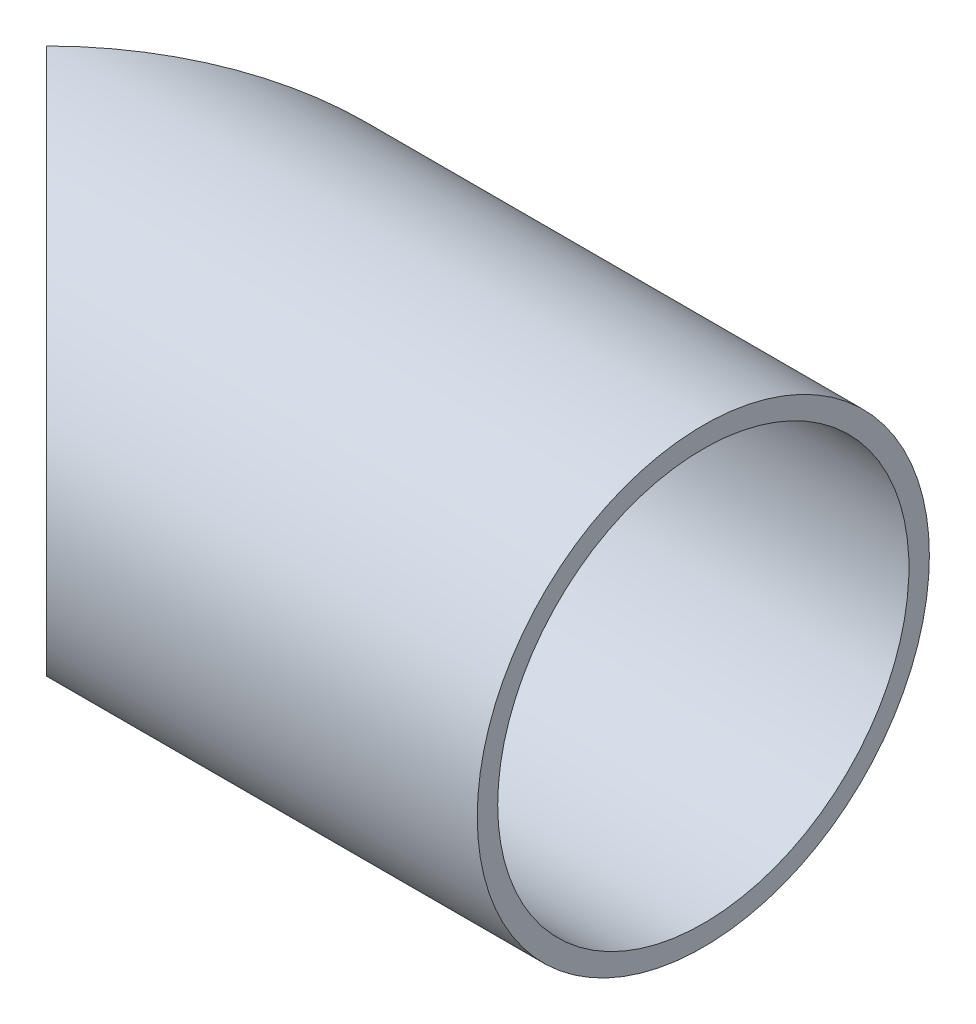
ISO-10303-21;
HEADER;
FILE_DESCRIPTION(('STEP AP214'),'2;1');
FILE_NAME('part.step','',(''),(''),'','','');
FILE_SCHEMA(('AUTOMOTIVE_DESIGN { 1 0 10303 214 1 1 1 1 }'));
ENDSEC;
DATA;
#1=APPLICATION_CONTEXT('core data for automotive mechanical design processes');
#2=APPLICATION_PROTOCOL_DEFINITION('international standard','automotive_design',2000,#1);
#3=PRODUCT_CONTEXT('',#1,'mechanical');
#4=PRODUCT('Part','Part','',(#3));
#5=PRODUCT_RELATED_PRODUCT_CATEGORY('part','',(#4));
#6=PRODUCT_DEFINITION_FORMATION('','',#4);
#7=PRODUCT_DEFINITION_CONTEXT('part definition',#1,'design');
#8=PRODUCT_DEFINITION('design','',#6,#7);
#9=PRODUCT_DEFINITION_SHAPE('','',#8);
#10=(LENGTH_UNIT() NAMED_UNIT(*) SI_UNIT(.MILLI.,.METRE.));
#11=(NAMED_UNIT(*) PLANE_ANGLE_UNIT() SI_UNIT($,.RADIAN.));
#12=(NAMED_UNIT(*) SI_UNIT($,.STERADIAN.) SOLID_ANGLE_UNIT());
#13=UNCERTAINTY_MEASURE_WITH_UNIT(LENGTH_MEASURE(1.E-05),#10,'distance_accuracy_value','');
#14=(GEOMETRIC_REPRESENTATION_CONTEXT(3) GLOBAL_UNCERTAINTY_ASSIGNED_CONTEXT((#13)) GLOBAL_UNIT_ASSIGNED_CONTEXT((#10,
#11,#12)) REPRESENTATION_CONTEXT('',''));
#15=CARTESIAN_POINT('',(0.,0.,0.));
#16=DIRECTION('',(0.,0.,1.));
#17=DIRECTION('',(1.,0.,0.));
#18=AXIS2_PLACEMENT_3D('',#15,#16,#17);
#19=CARTESIAN_POINT('',(0.,0.,0.));
#20=DIRECTION('',(-1.,0.,0.));
#21=DIRECTION('',(0.,0.,1.));
#22=AXIS2_PLACEMENT_3D('',#19,#20,#21);
#23=CYLINDRICAL_SURFACE('',#22,10.5);
#24=CARTESIAN_POINT('',(2.9,0.,-10.5));
#25=CARTESIAN_POINT('',(2.89999779863259,0.0504540532264274,-10.499999495684));
#26=CARTESIAN_POINT('',(2.89574304131396,0.10094232320822,-10.4996324661027));
#27=CARTESIAN_POINT('',(2.87883282986874,0.200521582916165,-10.4982036016795));
#28=CARTESIAN_POINT('',(2.86616789288237,0.249610930056723,-10.497140982548));
#29=CARTESIAN_POINT('',(2.83280657925466,0.344935741813993,-10.4944410029825));
#30=CARTESIAN_POINT('',(2.8121147874592,0.391172818171932,-10.4928039706974));
#31=CARTESIAN_POINT('',(2.76329542521253,0.479506607172749,-10.4891386785699));
#32=CARTESIAN_POINT('',(2.73516943051024,0.521604194627761,-10.487110501659));
#33=CARTESIAN_POINT('',(2.67219851331521,0.600588072516286,-10.4828843609423));
#34=CARTESIAN_POINT('',(2.63733773396015,0.637461700951317,-10.480686003921));
#35=CARTESIAN_POINT('',(2.56192037319322,0.704842285646807,-10.4763705644682));
#36=CARTESIAN_POINT('',(2.52136354000138,0.735348960323559,-10.4742534856346));
#37=CARTESIAN_POINT('',(2.43562827171721,0.789172826367425,-10.4703361100643));
#38=CARTESIAN_POINT('',(2.39044279460022,0.812478839657522,-10.4685363076986));
#39=CARTESIAN_POINT('',(2.29678193125328,0.851168411468692,-10.4654618251682));
#40=CARTESIAN_POINT('',(2.24830660618794,0.866552117235136,-10.4641871352436));
#41=CARTESIAN_POINT('',(2.14956930671322,0.888923537308058,-10.4623105464146));
#42=CARTESIAN_POINT('',(2.09931205148371,0.895931938612588,-10.4617069900681));
#43=CARTESIAN_POINT('',(1.99833119470095,0.901417720323617,-10.4612357811633));
#44=CARTESIAN_POINT('',(1.94760760238042,0.899895269265794,-10.4613681140668));
#45=CARTESIAN_POINT('',(1.84727580502774,0.888379653939853,-10.4623522244313));
#46=CARTESIAN_POINT('',(1.7976649965983,0.878408986097642,-10.4632020911782));
#47=CARTESIAN_POINT('',(1.70082364962664,0.850314925357359,-10.4655225150104));
#48=CARTESIAN_POINT('',(1.65359313551799,0.832191448790167,-10.4669930784657));
#49=CARTESIAN_POINT('',(1.56278146928279,0.788281088630963,-10.4703913988247));
#50=CARTESIAN_POINT('',(1.51920521373779,0.76248412671281,-10.4723197563166));
#51=CARTESIAN_POINT('',(1.43699258714743,0.703966339251911,-10.4764158387747));
#52=CARTESIAN_POINT('',(1.39835632205457,0.671245365243461,-10.4785835688731));
#53=CARTESIAN_POINT('',(1.32698962347084,0.599682275323482,-10.4829226490968));
#54=CARTESIAN_POINT('',(1.2942786854994,0.560820713565983,-10.485093988271));
#55=CARTESIAN_POINT('',(1.23584196887676,0.478147384745274,-10.48918896233));
#56=CARTESIAN_POINT('',(1.21011619525634,0.434335614116919,-10.4911125970364));
#57=CARTESIAN_POINT('',(1.16638122443027,0.342992741040511,-10.4944958198701));
#58=CARTESIAN_POINT('',(1.14837290724387,0.295461215160317,-10.4959553550715));
#59=CARTESIAN_POINT('',(1.12059777300354,0.198033966338504,-10.4982453324096));
#60=CARTESIAN_POINT('',(1.11083077498583,0.148138295334449,-10.4990757883596));
#61=CARTESIAN_POINT('',(1.09984000937305,0.0475680752501909,-10.5000122643458));
#62=CARTESIAN_POINT('',(1.0985893168585,-0.00310351100283923,-10.500120567498));
#63=CARTESIAN_POINT('',(1.1045961067296,-0.103935631344798,-10.4996066360162));
#64=CARTESIAN_POINT('',(1.11185350508279,-0.154096170476285,-10.4989844085976));
#65=CARTESIAN_POINT('',(1.13464814670092,-0.25240542646769,-10.4970808526053));
#66=CARTESIAN_POINT('',(1.1501728931489,-0.300557061811421,-10.4958005189179));
#67=CARTESIAN_POINT('',(1.18904876601968,-0.393572106736426,-10.4927245530826));
#68=CARTESIAN_POINT('',(1.21240002310381,-0.438435461405568,-10.490928912332));
#69=CARTESIAN_POINT('',(1.26633360588341,-0.523722864502319,-10.4870178742457));
#70=CARTESIAN_POINT('',(1.29693374945803,-0.564135608882735,-10.4849016937148));
#71=CARTESIAN_POINT('',(1.36447076597735,-0.639260472507932,-10.4805899025468));
#72=CARTESIAN_POINT('',(1.40140775541085,-0.673972486934518,-10.4783942904502));
#73=CARTESIAN_POINT('',(1.48068688092173,-0.736803049806465,-10.474164321982));
#74=CARTESIAN_POINT('',(1.5230429790687,-0.764904014705594,-10.4721304049669));
#75=CARTESIAN_POINT('',(1.61188857350658,-0.813594189687383,-10.4684604038335));
#76=CARTESIAN_POINT('',(1.65837802647671,-0.834183478486727,-10.4668243155463));
#77=CARTESIAN_POINT('',(1.7541086633372,-0.86723596273692,-10.4641377235078));
#78=CARTESIAN_POINT('',(1.80334612203322,-0.879709882187555,-10.4630864472281));
#79=CARTESIAN_POINT('',(1.90322601721336,-0.896212438900428,-10.4616859509123));
#80=CARTESIAN_POINT('',(1.9538684249532,-0.900241248814861,-10.4613367165236));
#81=CARTESIAN_POINT('',(2.0549459194371,-0.899737177059251,-10.4613800685233));
#82=CARTESIAN_POINT('',(2.10538114727868,-0.895231922008628,-10.4617702612274));
#83=CARTESIAN_POINT('',(2.20477577823446,-0.877845256671528,-10.4632434143281));
#84=CARTESIAN_POINT('',(2.25373517916612,-0.864963833998445,-10.4643263757491));
#85=CARTESIAN_POINT('',(2.34878990647217,-0.831197573762159,-10.4670624094963));
#86=CARTESIAN_POINT('',(2.39488542619592,-0.810313277181222,-10.4687154432858));
#87=CARTESIAN_POINT('',(2.48292067273923,-0.761137152412855,-10.4724054329102));
#88=CARTESIAN_POINT('',(2.52486045920794,-0.732845430568861,-10.4744423832334));
#89=CARTESIAN_POINT('',(2.60353515378189,-0.669553715709395,-10.4786785448443));
#90=CARTESIAN_POINT('',(2.64025355990508,-0.634533242193162,-10.4808782385751));
#91=CARTESIAN_POINT('',(2.7073064080301,-0.558815882240811,-10.4851876266694));
#92=CARTESIAN_POINT('',(2.73763930531487,-0.518117626243553,-10.4872972991577));
#93=CARTESIAN_POINT('',(2.7911032485324,-0.432117196155755,-10.4911929654974));
#94=CARTESIAN_POINT('',(2.81422016310366,-0.386806215934731,-10.4929783214045));
#95=CARTESIAN_POINT('',(2.85248803330017,-0.292961242645931,-10.4960168004137));
#96=CARTESIAN_POINT('',(2.86764812265522,-0.244431017417025,-10.4972705334525));
#97=CARTESIAN_POINT('',(2.88572164829214,-0.163013325447794,-10.4987835505666));
#98=CARTESIAN_POINT('',(2.89106888733595,-0.13064907329781,-10.4992376358007));
#99=CARTESIAN_POINT('',(2.89820877306998,-0.065528025193228,-10.4998460238753));
#100=CARTESIAN_POINT('',(2.90000142984585,-0.0327712303526815,-10.5000003275665));
#101=CARTESIAN_POINT('',(2.9,0.,-10.5));
#102=B_SPLINE_CURVE_WITH_KNOTS('',3,(#24,#25,#26,#27,#28,#29,#30,#31,#32,#33,#34,#35,#36,#37,
#38,#39,#40,#41,#42,#43,#44,#45,#46,#47,#48,#49,#50,#51,#52,#53,#54,#55,#56,#57,#58,#59,#60,#61,
#62,#63,#64,#65,#66,#67,#68,#69,#70,#71,#72,#73,#74,#75,#76,#77,#78,#79,#80,#81,#82,#83,#84,#85,
#86,#87,#88,#89,#90,#91,#92,#93,#94,#95,#96,#97,#98,#99,#100,#101),.UNSPECIFIED.,.T.,.F.,(4,2,2,
2,2,2,2,2,2,2,2,2,2,2,2,2,2,2,2,2,2,2,2,2,2,2,2,2,2,2,2,2,2,2,2,2,2,2,4),(0.,0.151242506586224,
0.302655836191228,0.453982807309265,0.605277728944442,0.75693330990183,0.908595596529989,
1.06049214944224,1.21238587907716,1.36390365066285,1.5154184288712,1.66653100770665,
1.81764513738739,1.96895862277438,2.12027535297661,2.27208124416179,2.42388724467837,
2.57571055098452,2.72753052345152,2.87887028225293,3.03020854631916,3.18131869606406,
3.33243136867472,3.48391940490825,3.63541022621059,3.78729952719736,3.93918723645342,
4.09087382484149,4.24255731211196,4.39375060603966,4.54494412355122,4.69612742241034,
4.84730855095124,4.9989573399949,5.15064277231481,5.30262341951979,5.45442922273313,
5.55266547470274,5.65090144793983),.UNSPECIFIED.);
#103=CARTESIAN_POINT('',(2.9,0.,-10.5));
#104=VERTEX_POINT('',#103);
#105=EDGE_CURVE('E71',#104,#104,#102,.T.);
#106=ORIENTED_EDGE('',*,*,#105,.T.);
#107=EDGE_LOOP('',(#106));
#108=FACE_BOUND('',#107,.T.);
#109=CARTESIAN_POINT('',(20.,0.,0.));
#110=DIRECTION('',(-1.,0.,0.));
#111=DIRECTION('',(0.,0.,1.));
#112=AXIS2_PLACEMENT_3D('',#109,#110,#111);
#113=CIRCLE('',#112,10.5);
#114=CARTESIAN_POINT('',(20.,0.,10.5));
#115=VERTEX_POINT('',#114);
#116=EDGE_CURVE('E68',#115,#115,#113,.T.);
#117=ORIENTED_EDGE('',*,*,#116,.T.);
#118=EDGE_LOOP('',(#117));
#119=FACE_BOUND('',#118,.T.);
#120=CARTESIAN_POINT('',(-10.5,0.,0.));
#121=DIRECTION('',(-0.707106781186547,0.,0.707106781186547));
#122=DIRECTION('',(-0.707106781186547,0.,-0.707106781186547));
#123=AXIS2_PLACEMENT_3D('',#120,#121,#122);
#124=ELLIPSE('',#123,14.8492424049175,10.5);
#125=CARTESIAN_POINT('',(-10.5,-10.5,0.));
#126=VERTEX_POINT('',#125);
#127=CARTESIAN_POINT('',(-10.5,10.5,0.));
#128=VERTEX_POINT('',#127);
#129=EDGE_CURVE('E63',#126,#128,#124,.T.);
#130=ORIENTED_EDGE('',*,*,#129,.F.);
#131=CARTESIAN_POINT('',(-10.5,0.,0.));
#132=DIRECTION('',(-0.707106781186547,0.,-0.707106781186547));
#133=DIRECTION('',(-0.707106781186547,0.,0.707106781186547));
#134=AXIS2_PLACEMENT_3D('',#131,#132,#133);
#135=ELLIPSE('',#134,14.8492424049175,10.5);
#136=EDGE_CURVE('E61',#128,#126,#135,.T.);
#137=ORIENTED_EDGE('',*,*,#136,.F.);
#138=EDGE_LOOP('',(#130,#137));
#139=FACE_BOUND('',#138,.T.);
#140=ADVANCED_FACE('F41',(#108,#119,#139),#23,.T.);
#141=CARTESIAN_POINT('',(0.,0.,0.));
#142=DIRECTION('',(-1.,0.,0.));
#143=DIRECTION('',(0.,0.,1.));
#144=AXIS2_PLACEMENT_3D('',#141,#142,#143);
#145=CYLINDRICAL_SURFACE('',#144,9.55);
#146=CARTESIAN_POINT('',(2.9,0.,-9.55));
#147=CARTESIAN_POINT('',(2.89999780884723,0.0504333770996798,-9.54999944986076));
#148=CARTESIAN_POINT('',(2.89574652294859,0.10090046045354,-9.54959624319821));
#149=CARTESIAN_POINT('',(2.87885090630755,0.200436515602091,-9.54802654191983));
#150=CARTESIAN_POINT('',(2.86619723287062,0.249503867610081,-9.54685919767271));
#151=CARTESIAN_POINT('',(2.83286757719439,0.344784592035012,-9.54389304594052));
#152=CARTESIAN_POINT('',(2.81219632838323,0.390999629779705,-9.54209461109924));
#153=CARTESIAN_POINT('',(2.76342723367341,0.479293648716003,-9.53806758968694));
#154=CARTESIAN_POINT('',(2.73533090538013,0.521373472691947,-9.53583909104136));
#155=CARTESIAN_POINT('',(2.67241207481323,0.60034829386983,-9.53119372234366));
#156=CARTESIAN_POINT('',(2.63757059272861,0.637228140771976,-9.52877633250596));
#157=CARTESIAN_POINT('',(2.56219084559125,0.704625983614027,-9.52402995716957));
#158=CARTESIAN_POINT('',(2.52165232213063,0.735143690822338,-9.52170097568703));
#159=CARTESIAN_POINT('',(2.4359354205909,0.789003849134793,-9.51738971398328));
#160=CARTESIAN_POINT('',(2.3907484739012,0.812332720824696,-9.5154080929178));
#161=CARTESIAN_POINT('',(2.29707693999983,0.851066269194833,-9.51202220660178));
#162=CARTESIAN_POINT('',(2.24859242574987,0.866471121136757,-9.51061792858185));
#163=CARTESIAN_POINT('',(2.14985570426576,0.888874745261589,-9.50855032038307));
#164=CARTESIAN_POINT('',(2.09960921326338,0.895898503288517,-9.50788478825972));
#165=CARTESIAN_POINT('',(1.99864646686942,0.901417779764297,-9.50736315078987));
#166=CARTESIAN_POINT('',(1.94793022255865,0.89991349886831,-9.50750702639891));
#167=CARTESIAN_POINT('',(1.84763948270622,0.888440012128942,-9.50858594049473));
#168=CARTESIAN_POINT('',(1.79806184024906,0.878498040804204,-9.50951843350977));
#169=CARTESIAN_POINT('',(1.70128201593777,0.850473741980112,-9.51206553255591));
#170=CARTESIAN_POINT('',(1.65407986294127,0.832391315616407,-9.51368014687123));
#171=CARTESIAN_POINT('',(1.5633046024765,0.788569181007379,-9.51741249285591));
#172=CARTESIAN_POINT('',(1.5197373861864,0.76281734005178,-9.51953102061922));
#173=CARTESIAN_POINT('',(1.43753316280169,0.704396104543006,-9.52403179493855));
#174=CARTESIAN_POINT('',(1.39889628380095,0.671726530320523,-9.52641404834336));
#175=CARTESIAN_POINT('',(1.32749120040153,0.600244852158614,-9.53118519179668));
#176=CARTESIAN_POINT('',(1.29474654517105,0.561409218968174,-9.53357407135109));
#177=CARTESIAN_POINT('',(1.23623777026864,0.478779667011638,-9.538080473618));
#178=CARTESIAN_POINT('',(1.21047365715728,0.434985743585615,-9.54019799607546));
#179=CARTESIAN_POINT('',(1.16665845040846,0.343666812908452,-9.54392368126632));
#180=CARTESIAN_POINT('',(1.14860849602396,0.296141255783032,-9.54553176875558));
#181=CARTESIAN_POINT('',(1.12075095493928,0.198715582138872,-9.54805659777153));
#182=CARTESIAN_POINT('',(1.11094314939205,0.148815528705376,-9.5489733576544));
#183=CARTESIAN_POINT('',(1.09987806053933,0.0482613452693576,-9.55000988090179));
#184=CARTESIAN_POINT('',(1.09858826966231,-0.00238917764715689,-9.55013267426844));
#185=CARTESIAN_POINT('',(1.10451052342864,-0.103185689674357,-9.54957554202111));
#186=CARTESIAN_POINT('',(1.11172246626403,-0.153331684819493,-9.54889562601955));
#187=CARTESIAN_POINT('',(1.13441650728167,-0.251602270308619,-9.54681144375323));
#188=CARTESIAN_POINT('',(1.14988344064045,-0.299730393282177,-9.54540850587721));
#189=CARTESIAN_POINT('',(1.18863286384996,-0.392708722858053,-9.54203574606673));
#190=CARTESIAN_POINT('',(1.21191551023524,-0.43755886378643,-9.54006591277849));
#191=CARTESIAN_POINT('',(1.26571646196012,-0.522855427342952,-9.53577232362892));
#192=CARTESIAN_POINT('',(1.29625619032409,-0.563288284157764,-9.53344752731578));
#193=CARTESIAN_POINT('',(1.36367359454641,-0.638465358868746,-9.52870838913467));
#194=CARTESIAN_POINT('',(1.40055141144753,-0.673209450138052,-9.52629404527493));
#195=CARTESIAN_POINT('',(1.47973972521151,-0.736135109087978,-9.52163885943567));
#196=CARTESIAN_POINT('',(1.52206717901137,-0.764295386200231,-9.519398595567));
#197=CARTESIAN_POINT('',(1.6108693292807,-0.813107828374153,-9.51535380895649));
#198=CARTESIAN_POINT('',(1.65734397455804,-0.833760086097369,-9.51354928083703));
#199=CARTESIAN_POINT('',(1.7530473813198,-0.866934375988278,-9.51058377013521));
#200=CARTESIAN_POINT('',(1.80227167273399,-0.879469209437664,-9.50942177469564));
#201=CARTESIAN_POINT('',(1.90213774704683,-0.896094421889859,-9.50786966745646));
#202=CARTESIAN_POINT('',(1.95277949420117,-0.900185013639004,-9.50747953621032));
#203=CARTESIAN_POINT('',(2.05383134902245,-0.899802857234391,-9.50751569560366));
#204=CARTESIAN_POINT('',(2.1042415876694,-0.895363555868843,-9.50793879745557));
#205=CARTESIAN_POINT('',(2.20359689541702,-0.878117616382852,-9.5095469600127));
#206=CARTESIAN_POINT('',(2.252541962636,-0.865310967516846,-9.51073202169644));
#207=CARTESIAN_POINT('',(2.34757817499034,-0.831702827483668,-9.5137297099796));
#208=CARTESIAN_POINT('',(2.39366962192334,-0.81090218344074,-9.51554227008094));
#209=CARTESIAN_POINT('',(2.4817120991938,-0.761900042630001,-9.51959085689515));
#210=CARTESIAN_POINT('',(2.5236631679333,-0.73369861451339,-9.52182687967985));
#211=CARTESIAN_POINT('',(2.6024054323216,-0.670569715972579,-9.5264809309625));
#212=CARTESIAN_POINT('',(2.63917663942982,-0.635617361075034,-9.52889961201889));
#213=CARTESIAN_POINT('',(2.70634737504161,-0.560026869644902,-9.53364048294526));
#214=CARTESIAN_POINT('',(2.73674536970598,-0.519387368303574,-9.53596264947956));
#215=CARTESIAN_POINT('',(2.79035973214162,-0.433476748777413,-9.54025421807277));
#216=CARTESIAN_POINT('',(2.81355960911384,-0.388195306872946,-9.54222280580866));
#217=CARTESIAN_POINT('',(2.85199626463914,-0.294390688424181,-9.54557634391662));
#218=CARTESIAN_POINT('',(2.86724208582308,-0.245871264127059,-9.5469619566998));
#219=CARTESIAN_POINT('',(2.88550646475054,-0.164227381576658,-9.54864249295145));
#220=CARTESIAN_POINT('',(2.89093418874281,-0.131626030054151,-9.54914920496252));
#221=CARTESIAN_POINT('',(2.89818166719427,-0.0660212670045082,-9.54982813797415));
#222=CARTESIAN_POINT('',(2.9000014345097,-0.0330178569104508,-9.55000036016661));
#223=CARTESIAN_POINT('',(2.9,0.,-9.55));
#224=B_SPLINE_CURVE_WITH_KNOTS('',3,(#146,#147,#148,#149,#150,#151,#152,#153,#154,#155,#156,
#157,#158,#159,#160,#161,#162,#163,#164,#165,#166,#167,#168,#169,#170,#171,#172,#173,#174,#175,
#176,#177,#178,#179,#180,#181,#182,#183,#184,#185,#186,#187,#188,#189,#190,#191,#192,#193,#194,
#195,#196,#197,#198,#199,#200,#201,#202,#203,#204,#205,#206,#207,#208,#209,#210,#211,#212,#213,
#214,#215,#216,#217,#218,#219,#220,#221,#222,#223),.UNSPECIFIED.,.T.,.F.,(4,2,2,2,2,2,2,2,2,2,2,
2,2,2,2,2,2,2,2,2,2,2,2,2,2,2,2,2,2,2,2,2,2,2,2,2,2,2,4),(0.,0.151179568943383,
0.302527517995877,0.453786249695487,0.605014089635808,0.756673814001164,0.908340419609051,
1.06029178542309,1.21223979026641,1.36373366455058,1.51522397436914,1.66622716711341,
1.81723219381355,1.96847738499538,2.11972650484168,2.27156730203569,2.42340824193469,
2.57527159847291,2.72713092257962,2.87841036452192,3.02968799491667,3.18068867261004,
3.33169237475346,3.48314750462419,3.63460600529327,3.78654771570448,3.93848755083656,
4.09018718761486,4.24188300238795,4.39298521236683,4.54408761639542,4.69517401250463,
4.84625900715479,4.99791192493686,5.14960129919244,5.30163566873958,5.45349681810327,
5.55247181143082,5.65144645207981),.UNSPECIFIED.);
#225=CARTESIAN_POINT('',(2.9,0.,-9.55));
#226=VERTEX_POINT('',#225);
#227=EDGE_CURVE('E45',#226,#226,#224,.T.);
#228=ORIENTED_EDGE('',*,*,#227,.F.);
#229=EDGE_LOOP('',(#228));
#230=FACE_BOUND('',#229,.T.);
#231=CARTESIAN_POINT('',(20.,0.,0.));
#232=DIRECTION('',(-1.,0.,0.));
#233=DIRECTION('',(0.,0.,1.));
#234=AXIS2_PLACEMENT_3D('',#231,#232,#233);
#235=CIRCLE('',#234,9.55);
#236=CARTESIAN_POINT('',(20.,0.,9.55));
#237=VERTEX_POINT('',#236);
#238=EDGE_CURVE('E55',#237,#237,#235,.T.);
#239=ORIENTED_EDGE('',*,*,#238,.F.);
#240=EDGE_LOOP('',(#239));
#241=FACE_BOUND('',#240,.T.);
#242=CARTESIAN_POINT('',(0.,0.,9.55));
#243=CARTESIAN_POINT('',(-1.55016439686144E-06,0.220574282213808,9.54999842880472));
#244=CARTESIAN_POINT('',(-0.00696527093612184,0.441172881995941,9.54234347170654));
#245=CARTESIAN_POINT('',(-0.0346645493320943,0.880462247515584,9.51187602399584));
#246=CARTESIAN_POINT('',(-0.0554021637739905,1.09915272337616,9.48906126961228));
#247=CARTESIAN_POINT('',(-0.110201791348231,1.53294557827491,9.42870970253865));
#248=CARTESIAN_POINT('',(-0.14427303400446,1.74804536407523,9.39116269214881));
#249=CARTESIAN_POINT('',(-0.225014344574038,2.17288523109862,9.3020527420049));
#250=CARTESIAN_POINT('',(-0.271684243147141,2.38262538431976,9.25048999063825));
#251=CARTESIAN_POINT('',(-0.376354500288009,2.79402169189252,9.13462156791325));
#252=CARTESIAN_POINT('',(-0.434276671799415,2.99572267224584,9.07040378873359));
#253=CARTESIAN_POINT('',(-0.560662161095531,3.39157156837163,8.92994266069807));
#254=CARTESIAN_POINT('',(-0.629130112691609,3.58571611664613,8.8536940251277));
#255=CARTESIAN_POINT('',(-0.775515277782854,3.96558031099309,8.69019158388276));
#256=CARTESIAN_POINT('',(-0.853431642258823,4.1513007119882,8.60293876699807));
#257=CARTESIAN_POINT('',(-1.01765518739125,4.5138410023519,8.41838077874061));
#258=CARTESIAN_POINT('',(-1.10396426166289,4.690658869353,8.32107333846988));
#259=CARTESIAN_POINT('',(-1.31986214971061,5.10381809523147,8.07662760886038));
#260=CARTESIAN_POINT('',(-1.45297333421459,5.33574141040884,7.92510450748946));
#261=CARTESIAN_POINT('',(-1.73085282433067,5.78109040833513,7.60634907398851));
#262=CARTESIAN_POINT('',(-1.87562542236348,5.99450921923345,7.4391109535482));
#263=CARTESIAN_POINT('',(-2.17455742239463,6.40322035683602,7.09038668656487));
#264=CARTESIAN_POINT('',(-2.32873565544062,6.59847420245711,6.90887173127468));
#265=CARTESIAN_POINT('',(-2.64373683377131,6.97054793975606,6.53328725090287));
#266=CARTESIAN_POINT('',(-2.80455892597966,7.14737018785558,6.33921933583127));
#267=CARTESIAN_POINT('',(-3.13433265841546,7.48694031348743,5.93461444534024));
#268=CARTESIAN_POINT('',(-3.30338672880583,7.64925095561886,5.72379475912219));
#269=CARTESIAN_POINT('',(-3.64317701026206,7.95526535394853,5.29024495199638));
#270=CARTESIAN_POINT('',(-3.81391363140587,8.09896444700987,5.06751186585329));
#271=CARTESIAN_POINT('',(-4.15340186997913,8.36764221697699,4.61034249956056));
#272=CARTESIAN_POINT('',(-4.32215653170289,8.49265445083188,4.3759282307238));
#273=CARTESIAN_POINT('',(-4.65354709873289,8.72409021537935,3.89412032272076));
#274=CARTESIAN_POINT('',(-4.81618654298043,8.83052463132022,3.64673439525906));
#275=CARTESIAN_POINT('',(-5.12678136776727,9.02282379238248,3.14060418456797));
#276=CARTESIAN_POINT('',(-5.27491604729169,9.10896542905147,2.88207768132384));
#277=CARTESIAN_POINT('',(-5.5495244958063,9.26106423459288,2.34783724410935));
#278=CARTESIAN_POINT('',(-5.67600831919718,9.32703078379462,2.07213136961774));
#279=CARTESIAN_POINT('',(-5.87376299125925,9.42646281802629,1.54988898553449));
#280=CARTESIAN_POINT('',(-5.95075851300733,9.46354198625341,1.3063292929072));
#281=CARTESIAN_POINT('',(-6.03863095389858,9.5051156604462,0.933241147135417));
#282=CARTESIAN_POINT('',(-6.06330776869749,9.51662835144927,0.807711715494538));
#283=CARTESIAN_POINT('',(-6.10231346885637,9.53471679589305,0.554730248925886));
#284=CARTESIAN_POINT('',(-6.11664768833331,9.54129509427963,0.427279239714138));
#285=CARTESIAN_POINT('',(-6.13423022132566,9.54935347275128,0.170331434968808));
#286=CARTESIAN_POINT('',(-6.13738140884579,9.55078888728765,0.0408264818638232));
#287=CARTESIAN_POINT('',(-6.13213442875822,9.5483903189909,-0.217896091016035));
#288=CARTESIAN_POINT('',(-6.12373623181743,9.54455632277454,-0.347113710060302));
#289=CARTESIAN_POINT('',(-6.09587687143741,9.53173277981832,-0.604303203875862));
#290=CARTESIAN_POINT('',(-6.07639619089835,9.52273413749397,-0.73227247472453));
#291=CARTESIAN_POINT('',(-6.027427787887,9.49983278261041,-0.985850857175301));
#292=CARTESIAN_POINT('',(-5.99793593953962,9.48592804802359,-1.11145897311979));
#293=CARTESIAN_POINT('',(-5.91862014082505,9.44793606754178,-1.40263364741395));
#294=CARTESIAN_POINT('',(-5.86529191237304,9.42199042998925,-1.56700001627018));
#295=CARTESIAN_POINT('',(-5.74643425151322,9.36258607244638,-1.88983172148564));
#296=CARTESIAN_POINT('',(-5.68089874111454,9.32912360812019,-2.04829407086992));
#297=CARTESIAN_POINT('',(-5.54044586625239,9.25522192061193,-2.35989167110624));
#298=CARTESIAN_POINT('',(-5.46549988165019,9.2147612657087,-2.51300876823414));
#299=CARTESIAN_POINT('',(-5.30878294373484,9.12739532255464,-2.81383754919094));
#300=CARTESIAN_POINT('',(-5.22700936346913,9.08048754921492,-2.96154712071158));
#301=CARTESIAN_POINT('',(-4.97971373213672,8.93376801289111,-3.38805371462386));
#302=CARTESIAN_POINT('',(-4.80747165859402,8.82554744306821,-3.66008411362371));
#303=CARTESIAN_POINT('',(-4.45411542320309,8.5873690991685,-4.18850412978263));
#304=CARTESIAN_POINT('',(-4.27299416560689,8.45739373284015,-4.44488085757127));
#305=CARTESIAN_POINT('',(-3.90760562078547,8.17579532747067,-4.94378367640393));
#306=CARTESIAN_POINT('',(-3.72333415391744,8.02414118306894,-5.18628915219097));
#307=CARTESIAN_POINT('',(-3.35631516803992,7.69921205279239,-5.65742621861303));
#308=CARTESIAN_POINT('',(-3.1735672007705,7.52594368457637,-5.88606202403615));
#309=CARTESIAN_POINT('',(-2.80237844453799,7.14641215074716,-6.34227659181887));
#310=CARTESIAN_POINT('',(-2.61424293910516,6.93880150606195,-6.56898825916854));
#311=CARTESIAN_POINT('',(-2.24743480802765,6.49825750589455,-7.00508427261457));
#312=CARTESIAN_POINT('',(-2.06876488349823,6.26531697950263,-7.21446368223293));
#313=CARTESIAN_POINT('',(-1.72547517913569,5.7746924001176,-7.61281439753804));
#314=CARTESIAN_POINT('',(-1.56081014356669,5.51709424697263,-7.80185200581992));
#315=CARTESIAN_POINT('',(-1.24912709947325,4.97679050123585,-8.15710733119698));
#316=CARTESIAN_POINT('',(-1.10209586667824,4.69410400372635,-8.32334216259646));
#317=CARTESIAN_POINT('',(-0.88163422302096,4.21636767624743,-8.57130906887679));
#318=CARTESIAN_POINT('',(-0.801407965519166,4.02863909924136,-8.6612124109364));
#319=CARTESIAN_POINT('',(-0.650614447134722,3.64446798100714,-8.82974032908086));
#320=CARTESIAN_POINT('',(-0.580044221428796,3.4480281391575,-8.90836836753385));
#321=CARTESIAN_POINT('',(-0.449698740162347,3.04726506666906,-9.05328985743474));
#322=CARTESIAN_POINT('',(-0.38991868085887,2.84294539351745,-9.11958879815221));
#323=CARTESIAN_POINT('',(-0.282179367565618,2.42738687747593,-9.23888602283679));
#324=CARTESIAN_POINT('',(-0.234220517322117,2.21614779853695,-9.2918838525136));
#325=CARTESIAN_POINT('',(-0.150793550150092,1.78664586683344,-9.38397342422707));
#326=CARTESIAN_POINT('',(-0.115413410838005,1.56834476105856,-9.42296723831616));
#327=CARTESIAN_POINT('',(-0.0583800258488412,1.12778583339814,-9.48578416990148));
#328=CARTESIAN_POINT('',(-0.0367267258778368,0.905528027166156,-9.50960734740232));
#329=CARTESIAN_POINT('',(-0.00765383558497846,0.459028304646362,-9.54158647466287));
#330=CARTESIAN_POINT('',(-0.000229694721637733,0.234787045729678,-9.5497474332634));
#331=CARTESIAN_POINT('',(0.000219124936845714,-0.213717340796843,-9.55024094550488));
#332=CARTESIAN_POINT('',(-0.00675507279201301,-0.437980465335204,-9.54257473411093));
#333=CARTESIAN_POINT('',(-0.0335016574610959,-0.86189247565072,-9.51315507943714));
#334=CARTESIAN_POINT('',(-0.0519074469753848,-1.06173555258608,-9.4929057714004));
#335=CARTESIAN_POINT('',(-0.0998691105156604,-1.4584984233658,-9.44009242510562));
#336=CARTESIAN_POINT('',(-0.129428689094243,-1.65541722334843,-9.4075242953393));
#337=CARTESIAN_POINT('',(-0.199159472190343,-2.04495202889887,-9.33059907394564));
#338=CARTESIAN_POINT('',(-0.239327631883227,-2.23756925190819,-9.28624536493706));
#339=CARTESIAN_POINT('',(-0.329625249103798,-2.61756345827491,-9.18637454613411));
#340=CARTESIAN_POINT('',(-0.379758491656294,-2.80493841952664,-9.13085319445234));
#341=CARTESIAN_POINT('',(-0.491127015721263,-3.17994202893174,-9.00726278309859));
#342=CARTESIAN_POINT('',(-0.552688439581524,-3.36735173775612,-8.93882372601649));
#343=CARTESIAN_POINT('',(-0.68475294384914,-3.73485052400045,-8.7916224914048));
#344=CARTESIAN_POINT('',(-0.755259471112304,-3.91493674391526,-8.71285633409526));
#345=CARTESIAN_POINT('',(-0.978821115870656,-4.44333351095992,-8.46233264749426));
#346=CARTESIAN_POINT('',(-1.14397100553179,-4.77995525991497,-8.276291716785));
#347=CARTESIAN_POINT('',(-1.45577527514599,-5.34123078164447,-7.92185300040737));
#348=CARTESIAN_POINT('',(-1.59717267999165,-5.57321605625746,-7.76015281121345));
#349=CARTESIAN_POINT('',(-1.89131624315496,-6.01759840129866,-7.42085572572695));
#350=CARTESIAN_POINT('',(-2.0440635837837,-6.22999342585116,-7.24325717292261));
#351=CARTESIAN_POINT('',(-2.3585961690449,-6.63578666892647,-6.87345998931173));
#352=CARTESIAN_POINT('',(-2.52040625538978,-6.82912821786666,-6.68122065104451));
#353=CARTESIAN_POINT('',(-2.84999592920941,-7.19640821191732,-6.28389901134157));
#354=CARTESIAN_POINT('',(-3.01777447937636,-7.37035000714801,-6.07881893693773));
#355=CARTESIAN_POINT('',(-3.36067726999039,-7.70314852272935,-5.6514702391412));
#356=CARTESIAN_POINT('',(-3.53588122529484,-7.86154499439963,-5.42890784024927));
#357=CARTESIAN_POINT('',(-3.88655939829433,-8.15875092567028,-4.97109786462189));
#358=CARTESIAN_POINT('',(-4.06203369437093,-8.29755277696001,-4.73584540925324));
#359=CARTESIAN_POINT('',(-4.40867656370908,-8.5552481480142,-4.25265286559878));
#360=CARTESIAN_POINT('',(-4.57985454524045,-8.67418912250699,-4.00474492341309));
#361=CARTESIAN_POINT('',(-4.91252157230955,-8.89210225627363,-3.49428215853422));
#362=CARTESIAN_POINT('',(-5.07401932511121,-8.9910925562596,-3.23174092145891));
#363=CARTESIAN_POINT('',(-5.36266587688179,-9.15874818611278,-2.71755880998305));
#364=CARTESIAN_POINT('',(-5.49164054694359,-9.22950149679591,-2.4676459560891));
#365=CARTESIAN_POINT('',(-5.72457087064195,-9.3521421616201,-1.9519150448992));
#366=CARTESIAN_POINT('',(-5.82856259256946,-9.40405676949879,-1.68612061735177));
#367=CARTESIAN_POINT('',(-5.98314640959704,-9.47914990721538,-1.18383630669148));
#368=CARTESIAN_POINT('',(-6.03972320498754,-9.50565951744332,-0.949762575941793));
#369=CARTESIAN_POINT('',(-6.11614273105334,-9.54115890450965,-0.474565079416246));
#370=CARTESIAN_POINT('',(-6.13606869218358,-9.55018837947899,-0.233458553553935));
#371=CARTESIAN_POINT('',(-6.13522863849038,-9.5498050692226,0.249292214041436));
#372=CARTESIAN_POINT('',(-6.1143550750188,-9.54034354122291,0.490936195235516));
#373=CARTESIAN_POINT('',(-6.03602543076314,-9.50392683143218,0.967064897376575));
#374=CARTESIAN_POINT('',(-5.97848689061578,-9.47693221516291,1.2015322291637));
#375=CARTESIAN_POINT('',(-5.85168559259474,-9.41525105845096,1.60879647050014));
#376=CARTESIAN_POINT('',(-5.78778459086933,-9.38356199317581,1.78381538349107));
#377=CARTESIAN_POINT('',(-5.64744607354793,-9.31176329366399,2.12704288786811));
#378=CARTESIAN_POINT('',(-5.57099991177105,-9.27164784655007,2.29524668184409));
#379=CARTESIAN_POINT('',(-5.40876509143229,-9.18356525635248,2.62563838023031));
#380=CARTESIAN_POINT('',(-5.32294522738967,-9.13557160226819,2.78780362236339));
#381=CARTESIAN_POINT('',(-5.14478584287353,-9.03229319382483,3.10614995278231));
#382=CARTESIAN_POINT('',(-5.05244388733959,-8.97700570951484,3.2623287720705));
#383=CARTESIAN_POINT('',(-4.77949030855163,-8.80736566189615,3.7052748442559));
#384=CARTESIAN_POINT('',(-4.59316594435262,-8.68408505154265,3.98513183346054));
#385=CARTESIAN_POINT('',(-4.21380676182913,-8.41357811533717,4.52838178440256));
#386=CARTESIAN_POINT('',(-4.02076684249144,-8.26633326001688,4.79176178600195));
#387=CARTESIAN_POINT('',(-3.63402238874577,-7.94802301867264,5.30302154533462));
#388=CARTESIAN_POINT('',(-3.44031812473744,-7.77696640902357,5.55090696539946));
#389=CARTESIAN_POINT('',(-3.05676928313712,-7.41071038283583,6.03116857041811));
#390=CARTESIAN_POINT('',(-2.86692293302201,-7.21552235952821,6.2635519951875));
#391=CARTESIAN_POINT('',(-2.52844886741774,-6.83787899658739,6.6714761455923));
#392=CARTESIAN_POINT('',(-2.37855749233809,-6.65946577103518,6.8497147134133));
#393=CARTESIAN_POINT('',(-2.08601202851851,-6.28578582443041,7.19416157233789));
#394=CARTESIAN_POINT('',(-1.94335826422942,-6.09051834888612,7.36036932426098));
#395=CARTESIAN_POINT('',(-1.66768229174375,-5.68335482766449,7.67910907728425));
#396=CARTESIAN_POINT('',(-1.5346455253329,-5.47148497294588,7.83166183642432));
#397=CARTESIAN_POINT('',(-1.28026762720683,-5.03102026975657,8.1216257135314));
#398=CARTESIAN_POINT('',(-1.1589232179385,-4.80243014003524,8.25904107630672));
#399=CARTESIAN_POINT('',(-0.955791038379298,-4.38176245248664,8.48802423180545));
#400=CARTESIAN_POINT('',(-0.871209135834402,-4.19287709583013,8.58299028147399));
#401=CARTESIAN_POINT('',(-0.71177245970175,-3.80583506867972,8.76147868470747));
#402=CARTESIAN_POINT('',(-0.636915543339968,-3.6076804536776,8.8450035594076));
#403=CARTESIAN_POINT('',(-0.498181844881826,-3.20302026408344,8.99944531909741));
#404=CARTESIAN_POINT('',(-0.434294435193521,-2.9965230145009,9.07037440957541));
#405=CARTESIAN_POINT('',(-0.318573329693684,-2.57605594538368,9.19862566557317));
#406=CARTESIAN_POINT('',(-0.266737559963487,-2.36208741885133,9.25595017228682));
#407=CARTESIAN_POINT('',(-0.185266226058173,-1.97171328125714,9.34593595730118));
#408=CARTESIAN_POINT('',(-0.153262567295041,-1.79640456917985,9.38123866055458));
#409=CARTESIAN_POINT('',(-0.0980525974233897,-1.44274309790956,9.44209585790084));
#410=CARTESIAN_POINT('',(-0.0748451944536637,-1.26439071939464,9.46765156187122));
#411=CARTESIAN_POINT('',(-0.0375655777588238,-0.905543899869689,9.50868590742168));
#412=CARTESIAN_POINT('',(-0.0234950779382622,-0.725049063438531,9.52416265838863));
#413=CARTESIAN_POINT('',(-0.00471293754264724,-0.36304144571577,9.54481893587073));
#414=CARTESIAN_POINT('',(1.2757594498768E-06,-0.18152895802145,9.55000129306753));
#415=CARTESIAN_POINT('',(0.,0.,9.55));
#416=B_SPLINE_CURVE_WITH_KNOTS('',3,(#242,#243,#244,#245,#246,#247,#248,#249,#250,#251,#252,
#253,#254,#255,#256,#257,#258,#259,#260,#261,#262,#263,#264,#265,#266,#267,#268,#269,#270,#271,
#272,#273,#274,#275,#276,#277,#278,#279,#280,#281,#282,#283,#284,#285,#286,#287,#288,#289,#290,
#291,#292,#293,#294,#295,#296,#297,#298,#299,#300,#301,#302,#303,#304,#305,#306,#307,#308,#309,
#310,#311,#312,#313,#314,#315,#316,#317,#318,#319,#320,#321,#322,#323,#324,#325,#326,#327,#328,
#329,#330,#331,#332,#333,#334,#335,#336,#337,#338,#339,#340,#341,#342,#343,#344,#345,#346,#347,
#348,#349,#350,#351,#352,#353,#354,#355,#356,#357,#358,#359,#360,#361,#362,#363,#364,#365,#366,
#367,#368,#369,#370,#371,#372,#373,#374,#375,#376,#377,#378,#379,#380,#381,#382,#383,#384,#385,
#386,#387,#388,#389,#390,#391,#392,#393,#394,#395,#396,#397,#398,#399,#400,#401,#402,#403,#404,
#405,#406,#407,#408,#409,#410,#411,#412,#413,#414,#415),.UNSPECIFIED.,.T.,.F.,(4,2,2,2,2,2,2,2,
2,2,2,2,2,2,2,2,2,2,2,2,2,2,2,2,2,2,2,2,2,2,2,2,2,2,2,2,2,2,2,2,2,2,2,2,2,2,2,2,2,2,2,2,2,2,2,2,
2,2,2,2,2,2,2,2,2,2,2,2,2,2,2,2,2,2,2,2,2,2,2,2,2,2,2,2,2,2,4),(0.,0.661524985005622,
1.32314877593289,1.98523135453965,2.64730503444751,3.30493296630472,3.96285068831393,
4.62070933464153,5.27871675704393,6.19941696622254,7.12045763604393,8.04340702972203,
8.96623828213189,9.91111927364743,10.856236549674,11.7996356972298,12.742480212383,
13.6715990401252,14.6002852186023,15.3715601642722,15.7564563451032,16.1411538764113,
16.5291844851474,16.9172160794046,17.3059331517399,17.6948106198648,18.2181444799897,
18.7417396073026,19.266967575499,19.7923985674158,20.8098377936896,21.8281037938835,
22.8478457775277,23.8672763080577,24.9471741500608,26.0273785118817,27.1039479760433,
28.1797049626437,28.8483438883423,29.5167770497839,30.1849118892431,30.8530695452842,
31.5258125038447,32.1985528014805,32.8710779181799,33.5435505609592,34.1479692160039,
34.7525887959895,35.3570350291655,35.9617112886162,36.5874703916534,37.2134713577419,
38.4649082977989,39.412257242812,40.3597050109078,41.309890662669,42.25991197311,43.23265333002,
44.2057713556861,45.1765299108154,46.1464017540108,47.0149199501661,47.8821766139602,
48.6061112568693,49.3283998757335,50.0525950347917,50.7784246815371,51.3446195662641,
51.9112063266779,52.4797403413913,53.0484877552008,54.1211915528826,55.1947287545062,
56.267871321583,57.3405091440393,58.2198876015846,59.0993054455295,59.9773628686064,
60.8551734378255,61.5376764281848,62.2200287819267,62.9017162753158,63.5832863728505,
64.1278256859141,64.6722973842753,65.2168711854115,65.7612952226473),.UNSPECIFIED.);
#417=CARTESIAN_POINT('',(0.,0.,9.55));
#418=VERTEX_POINT('',#417);
#419=EDGE_CURVE('E11',#418,#418,#416,.T.);
#420=ORIENTED_EDGE('',*,*,#419,.T.);
#421=EDGE_LOOP('',(#420));
#422=FACE_BOUND('',#421,.T.);
#423=ADVANCED_FACE('F89',(#230,#241,#422),#145,.F.);
#424=CARTESIAN_POINT('',(20.,0.,0.));
#425=DIRECTION('',(-1.,0.,0.));
#426=DIRECTION('',(0.,0.,1.));
#427=AXIS2_PLACEMENT_3D('',#424,#425,#426);
#428=PLANE('',#427);
#429=ORIENTED_EDGE('',*,*,#116,.F.);
#430=EDGE_LOOP('',(#429));
#431=FACE_BOUND('',#430,.T.);
#432=ORIENTED_EDGE('',*,*,#238,.T.);
#433=EDGE_LOOP('',(#432));
#434=FACE_BOUND('',#433,.T.);
#435=ADVANCED_FACE('F95',(#431,#434),#428,.F.);
#436=CARTESIAN_POINT('',(-10.5,0.,-10.5));
#437=DIRECTION('',(0.,0.,1.));
#438=DIRECTION('',(1.,0.,0.));
#439=AXIS2_PLACEMENT_3D('',#436,#437,#438);
#440=CYLINDRICAL_SURFACE('',#439,10.5);
#441=ORIENTED_EDGE('',*,*,#129,.T.);
#442=ORIENTED_EDGE('',*,*,#136,.T.);
#443=EDGE_LOOP('',(#441,#442));
#444=FACE_BOUND('',#443,.T.);
#445=ORIENTED_EDGE('',*,*,#419,.F.);
#446=EDGE_LOOP('',(#445));
#447=FACE_BOUND('',#446,.T.);
#448=ADVANCED_FACE('F64',(#444,#447),#440,.F.);
#449=CARTESIAN_POINT('',(2.,0.,-10.5));
#450=DIRECTION('',(0.,0.,1.));
#451=DIRECTION('',(1.,0.,0.));
#452=AXIS2_PLACEMENT_3D('',#449,#450,#451);
#453=CYLINDRICAL_SURFACE('',#452,0.9);
#454=ORIENTED_EDGE('',*,*,#227,.T.);
#455=EDGE_LOOP('',(#454));
#456=FACE_BOUND('',#455,.T.);
#457=ORIENTED_EDGE('',*,*,#105,.F.);
#458=EDGE_LOOP('',(#457));
#459=FACE_BOUND('',#458,.T.);
#460=ADVANCED_FACE('F94',(#456,#459),#453,.F.);
#461=CLOSED_SHELL('',(#140,#423,#435,#448,#460));
#462=MANIFOLD_SOLID_BREP('B2',#461);
#463=ADVANCED_BREP_SHAPE_REPRESENTATION('',(#18,#462),#14);
#464=SHAPE_DEFINITION_REPRESENTATION(#9,#463);
ENDSEC;
END-ISO-10303-21;
